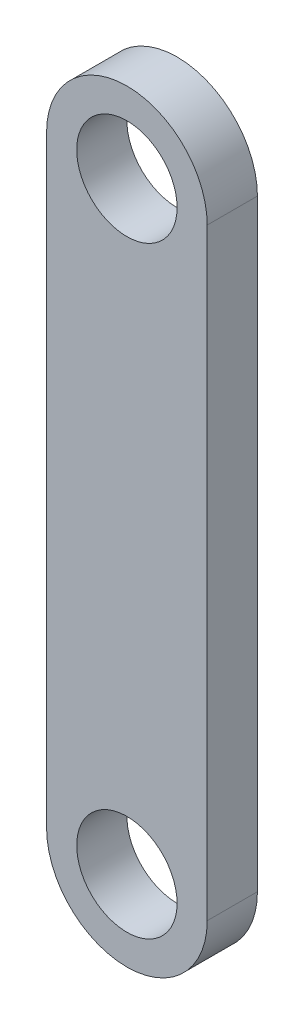
ISO-10303-21;
HEADER;
FILE_DESCRIPTION(('STEP AP214'),'2;1');
FILE_NAME('part.step','',(''),(''),'','','');
FILE_SCHEMA(('AUTOMOTIVE_DESIGN { 1 0 10303 214 1 1 1 1 }'));
ENDSEC;
DATA;
#1=APPLICATION_CONTEXT('core data for automotive mechanical design processes');
#2=APPLICATION_PROTOCOL_DEFINITION('international standard','automotive_design',2000,#1);
#3=PRODUCT_CONTEXT('',#1,'mechanical');
#4=PRODUCT('Part','Part','',(#3));
#5=PRODUCT_RELATED_PRODUCT_CATEGORY('part','',(#4));
#6=PRODUCT_DEFINITION_FORMATION('','',#4);
#7=PRODUCT_DEFINITION_CONTEXT('part definition',#1,'design');
#8=PRODUCT_DEFINITION('design','',#6,#7);
#9=PRODUCT_DEFINITION_SHAPE('','',#8);
#10=(LENGTH_UNIT() NAMED_UNIT(*) SI_UNIT(.MILLI.,.METRE.));
#11=(NAMED_UNIT(*) PLANE_ANGLE_UNIT() SI_UNIT($,.RADIAN.));
#12=(NAMED_UNIT(*) SI_UNIT($,.STERADIAN.) SOLID_ANGLE_UNIT());
#13=UNCERTAINTY_MEASURE_WITH_UNIT(LENGTH_MEASURE(1.E-05),#10,'distance_accuracy_value','');
#14=(GEOMETRIC_REPRESENTATION_CONTEXT(3) GLOBAL_UNCERTAINTY_ASSIGNED_CONTEXT((#13)) GLOBAL_UNIT_ASSIGNED_CONTEXT((#10,
#11,#12)) REPRESENTATION_CONTEXT('',''));
#15=CARTESIAN_POINT('',(0.,0.,0.));
#16=DIRECTION('',(0.,0.,1.));
#17=DIRECTION('',(1.,0.,0.));
#18=AXIS2_PLACEMENT_3D('',#15,#16,#17);
#19=CARTESIAN_POINT('',(0.,-3.,0.5));
#20=DIRECTION('',(0.,0.,1.));
#21=DIRECTION('',(1.,0.,0.));
#22=AXIS2_PLACEMENT_3D('',#19,#20,#21);
#23=PLANE('',#22);
#24=CARTESIAN_POINT('',(0.,3.,0.5));
#25=DIRECTION('',(0.,0.,1.));
#26=DIRECTION('',(1.,0.,0.));
#27=AXIS2_PLACEMENT_3D('',#24,#25,#26);
#28=CIRCLE('',#27,0.5);
#29=CARTESIAN_POINT('',(0.499999999999999,3.,0.5));
#30=VERTEX_POINT('',#29);
#31=EDGE_CURVE('E100',#30,#30,#28,.T.);
#32=ORIENTED_EDGE('',*,*,#31,.F.);
#33=EDGE_LOOP('',(#32));
#34=FACE_BOUND('',#33,.T.);
#35=CARTESIAN_POINT('',(0.,-3.,0.5));
#36=DIRECTION('',(0.,0.,1.));
#37=DIRECTION('',(1.,0.,0.));
#38=AXIS2_PLACEMENT_3D('',#35,#36,#37);
#39=CIRCLE('',#38,0.800000000000001);
#40=CARTESIAN_POINT('',(-0.800000000000001,-3.,0.5));
#41=VERTEX_POINT('',#40);
#42=CARTESIAN_POINT('',(0.800000000000001,-3.,0.5));
#43=VERTEX_POINT('',#42);
#44=EDGE_CURVE('E85',#41,#43,#39,.T.);
#45=ORIENTED_EDGE('',*,*,#44,.T.);
#46=DIRECTION('',(0.,1.,0.));
#47=VECTOR('',#46,1.);
#48=CARTESIAN_POINT('',(0.800000000000001,-3.,0.5));
#49=LINE('',#48,#47);
#50=CARTESIAN_POINT('',(0.8,3.,0.5));
#51=VERTEX_POINT('',#50);
#52=EDGE_CURVE('E80',#43,#51,#49,.T.);
#53=ORIENTED_EDGE('',*,*,#52,.T.);
#54=CARTESIAN_POINT('',(0.,3.,0.5));
#55=DIRECTION('',(0.,0.,1.));
#56=DIRECTION('',(1.,0.,0.));
#57=AXIS2_PLACEMENT_3D('',#54,#55,#56);
#58=CIRCLE('',#57,0.800000000000001);
#59=CARTESIAN_POINT('',(-0.800000000000002,3.,0.5));
#60=VERTEX_POINT('',#59);
#61=EDGE_CURVE('E83',#51,#60,#58,.T.);
#62=ORIENTED_EDGE('',*,*,#61,.T.);
#63=DIRECTION('',(0.,-1.,0.));
#64=VECTOR('',#63,1.);
#65=CARTESIAN_POINT('',(-0.800000000000001,-3.,0.5));
#66=LINE('',#65,#64);
#67=EDGE_CURVE('E50',#60,#41,#66,.T.);
#68=ORIENTED_EDGE('',*,*,#67,.T.);
#69=EDGE_LOOP('',(#45,#53,#62,#68));
#70=FACE_BOUND('',#69,.T.);
#71=CARTESIAN_POINT('',(0.,-3.,0.5));
#72=DIRECTION('',(0.,0.,1.));
#73=DIRECTION('',(1.,0.,0.));
#74=AXIS2_PLACEMENT_3D('',#71,#72,#73);
#75=CIRCLE('',#74,0.5);
#76=CARTESIAN_POINT('',(0.5,-3.,0.5));
#77=VERTEX_POINT('',#76);
#78=EDGE_CURVE('E115',#77,#77,#75,.T.);
#79=ORIENTED_EDGE('',*,*,#78,.F.);
#80=EDGE_LOOP('',(#79));
#81=FACE_BOUND('',#80,.T.);
#82=ADVANCED_FACE('F33',(#34,#70,#81),#23,.T.);
#83=CARTESIAN_POINT('',(0.,-3.,0.));
#84=DIRECTION('',(0.,0.,1.));
#85=DIRECTION('',(1.,0.,0.));
#86=AXIS2_PLACEMENT_3D('',#83,#84,#85);
#87=PLANE('',#86);
#88=CARTESIAN_POINT('',(0.,-3.,0.));
#89=DIRECTION('',(0.,0.,1.));
#90=DIRECTION('',(1.,0.,0.));
#91=AXIS2_PLACEMENT_3D('',#88,#89,#90);
#92=CIRCLE('',#91,0.800000000000001);
#93=CARTESIAN_POINT('',(-0.800000000000001,-3.,0.));
#94=VERTEX_POINT('',#93);
#95=CARTESIAN_POINT('',(0.800000000000001,-3.,0.));
#96=VERTEX_POINT('',#95);
#97=EDGE_CURVE('E97',#94,#96,#92,.T.);
#98=ORIENTED_EDGE('',*,*,#97,.F.);
#99=DIRECTION('',(0.,-1.,0.));
#100=VECTOR('',#99,1.);
#101=CARTESIAN_POINT('',(-0.800000000000001,-3.,0.));
#102=LINE('',#101,#100);
#103=CARTESIAN_POINT('',(-0.800000000000002,3.,0.));
#104=VERTEX_POINT('',#103);
#105=EDGE_CURVE('E73',#104,#94,#102,.T.);
#106=ORIENTED_EDGE('',*,*,#105,.F.);
#107=CARTESIAN_POINT('',(0.,3.,0.));
#108=DIRECTION('',(0.,0.,1.));
#109=DIRECTION('',(1.,0.,0.));
#110=AXIS2_PLACEMENT_3D('',#107,#108,#109);
#111=CIRCLE('',#110,0.800000000000001);
#112=CARTESIAN_POINT('',(0.8,3.,0.));
#113=VERTEX_POINT('',#112);
#114=EDGE_CURVE('E67',#113,#104,#111,.T.);
#115=ORIENTED_EDGE('',*,*,#114,.F.);
#116=DIRECTION('',(0.,1.,0.));
#117=VECTOR('',#116,1.);
#118=CARTESIAN_POINT('',(0.800000000000001,-3.,0.));
#119=LINE('',#118,#117);
#120=EDGE_CURVE('E89',#96,#113,#119,.T.);
#121=ORIENTED_EDGE('',*,*,#120,.F.);
#122=EDGE_LOOP('',(#98,#106,#115,#121));
#123=FACE_BOUND('',#122,.T.);
#124=CARTESIAN_POINT('',(0.,3.,0.));
#125=DIRECTION('',(0.,0.,1.));
#126=DIRECTION('',(1.,0.,0.));
#127=AXIS2_PLACEMENT_3D('',#124,#125,#126);
#128=CIRCLE('',#127,0.5);
#129=CARTESIAN_POINT('',(0.499999999999999,3.,0.));
#130=VERTEX_POINT('',#129);
#131=EDGE_CURVE('E112',#130,#130,#128,.T.);
#132=ORIENTED_EDGE('',*,*,#131,.T.);
#133=EDGE_LOOP('',(#132));
#134=FACE_BOUND('',#133,.T.);
#135=CARTESIAN_POINT('',(0.,-3.,0.));
#136=DIRECTION('',(0.,0.,1.));
#137=DIRECTION('',(1.,0.,0.));
#138=AXIS2_PLACEMENT_3D('',#135,#136,#137);
#139=CIRCLE('',#138,0.5);
#140=CARTESIAN_POINT('',(0.5,-3.,0.));
#141=VERTEX_POINT('',#140);
#142=EDGE_CURVE('E118',#141,#141,#139,.T.);
#143=ORIENTED_EDGE('',*,*,#142,.T.);
#144=EDGE_LOOP('',(#143));
#145=FACE_BOUND('',#144,.T.);
#146=ADVANCED_FACE('F108',(#123,#134,#145),#87,.F.);
#147=CARTESIAN_POINT('',(0.,-3.,0.5));
#148=DIRECTION('',(0.,0.,-1.));
#149=DIRECTION('',(-1.,0.,0.));
#150=AXIS2_PLACEMENT_3D('',#147,#148,#149);
#151=CYLINDRICAL_SURFACE('',#150,0.800000000000001);
#152=ORIENTED_EDGE('',*,*,#97,.T.);
#153=DIRECTION('',(0.,0.,-1.));
#154=VECTOR('',#153,1.);
#155=CARTESIAN_POINT('',(0.800000000000001,-3.,0.5));
#156=LINE('',#155,#154);
#157=EDGE_CURVE('E11',#43,#96,#156,.T.);
#158=ORIENTED_EDGE('',*,*,#157,.F.);
#159=ORIENTED_EDGE('',*,*,#44,.F.);
#160=DIRECTION('',(0.,0.,-1.));
#161=VECTOR('',#160,1.);
#162=CARTESIAN_POINT('',(-0.800000000000001,-3.,0.5));
#163=LINE('',#162,#161);
#164=EDGE_CURVE('E93',#41,#94,#163,.T.);
#165=ORIENTED_EDGE('',*,*,#164,.T.);
#166=EDGE_LOOP('',(#152,#158,#159,#165));
#167=FACE_BOUND('',#166,.T.);
#168=ADVANCED_FACE('F35',(#167),#151,.T.);
#169=CARTESIAN_POINT('',(0.800000000000001,-3.,0.5));
#170=DIRECTION('',(-1.,0.,0.));
#171=DIRECTION('',(0.,-1.,0.));
#172=AXIS2_PLACEMENT_3D('',#169,#170,#171);
#173=PLANE('',#172);
#174=ORIENTED_EDGE('',*,*,#120,.T.);
#175=DIRECTION('',(0.,0.,-1.));
#176=VECTOR('',#175,1.);
#177=CARTESIAN_POINT('',(0.8,3.,0.5));
#178=LINE('',#177,#176);
#179=EDGE_CURVE('E42',#51,#113,#178,.T.);
#180=ORIENTED_EDGE('',*,*,#179,.F.);
#181=ORIENTED_EDGE('',*,*,#52,.F.);
#182=ORIENTED_EDGE('',*,*,#157,.T.);
#183=EDGE_LOOP('',(#174,#180,#181,#182));
#184=FACE_BOUND('',#183,.T.);
#185=ADVANCED_FACE('F88',(#184),#173,.F.);
#186=CARTESIAN_POINT('',(0.,3.,0.5));
#187=DIRECTION('',(0.,0.,-1.));
#188=DIRECTION('',(-1.,0.,0.));
#189=AXIS2_PLACEMENT_3D('',#186,#187,#188);
#190=CYLINDRICAL_SURFACE('',#189,0.800000000000001);
#191=ORIENTED_EDGE('',*,*,#114,.T.);
#192=DIRECTION('',(0.,0.,-1.));
#193=VECTOR('',#192,1.);
#194=CARTESIAN_POINT('',(-0.800000000000002,3.,0.5));
#195=LINE('',#194,#193);
#196=EDGE_CURVE('E90',#60,#104,#195,.T.);
#197=ORIENTED_EDGE('',*,*,#196,.F.);
#198=ORIENTED_EDGE('',*,*,#61,.F.);
#199=ORIENTED_EDGE('',*,*,#179,.T.);
#200=EDGE_LOOP('',(#191,#197,#198,#199));
#201=FACE_BOUND('',#200,.T.);
#202=ADVANCED_FACE('F91',(#201),#190,.T.);
#203=CARTESIAN_POINT('',(-0.800000000000001,-3.,0.5));
#204=DIRECTION('',(1.,0.,0.));
#205=DIRECTION('',(0.,1.,0.));
#206=AXIS2_PLACEMENT_3D('',#203,#204,#205);
#207=PLANE('',#206);
#208=ORIENTED_EDGE('',*,*,#105,.T.);
#209=ORIENTED_EDGE('',*,*,#164,.F.);
#210=ORIENTED_EDGE('',*,*,#67,.F.);
#211=ORIENTED_EDGE('',*,*,#196,.T.);
#212=EDGE_LOOP('',(#208,#209,#210,#211));
#213=FACE_BOUND('',#212,.T.);
#214=ADVANCED_FACE('F105',(#213),#207,.F.);
#215=CARTESIAN_POINT('',(0.,3.,0.5));
#216=DIRECTION('',(0.,0.,-1.));
#217=DIRECTION('',(-1.,0.,0.));
#218=AXIS2_PLACEMENT_3D('',#215,#216,#217);
#219=CYLINDRICAL_SURFACE('',#218,0.5);
#220=ORIENTED_EDGE('',*,*,#31,.T.);
#221=EDGE_LOOP('',(#220));
#222=FACE_BOUND('',#221,.T.);
#223=ORIENTED_EDGE('',*,*,#131,.F.);
#224=EDGE_LOOP('',(#223));
#225=FACE_BOUND('',#224,.T.);
#226=ADVANCED_FACE('F135',(#222,#225),#219,.F.);
#227=CARTESIAN_POINT('',(0.,-3.,0.5));
#228=DIRECTION('',(0.,0.,-1.));
#229=DIRECTION('',(-1.,0.,0.));
#230=AXIS2_PLACEMENT_3D('',#227,#228,#229);
#231=CYLINDRICAL_SURFACE('',#230,0.5);
#232=ORIENTED_EDGE('',*,*,#78,.T.);
#233=EDGE_LOOP('',(#232));
#234=FACE_BOUND('',#233,.T.);
#235=ORIENTED_EDGE('',*,*,#142,.F.);
#236=EDGE_LOOP('',(#235));
#237=FACE_BOUND('',#236,.T.);
#238=ADVANCED_FACE('F124',(#234,#237),#231,.F.);
#239=CLOSED_SHELL('',(#82,#146,#168,#185,#202,#214,#226,#238));
#240=MANIFOLD_SOLID_BREP('B2',#239);
#241=ADVANCED_BREP_SHAPE_REPRESENTATION('',(#18,#240),#14);
#242=SHAPE_DEFINITION_REPRESENTATION(#9,#241);
ENDSEC;
END-ISO-10303-21;
